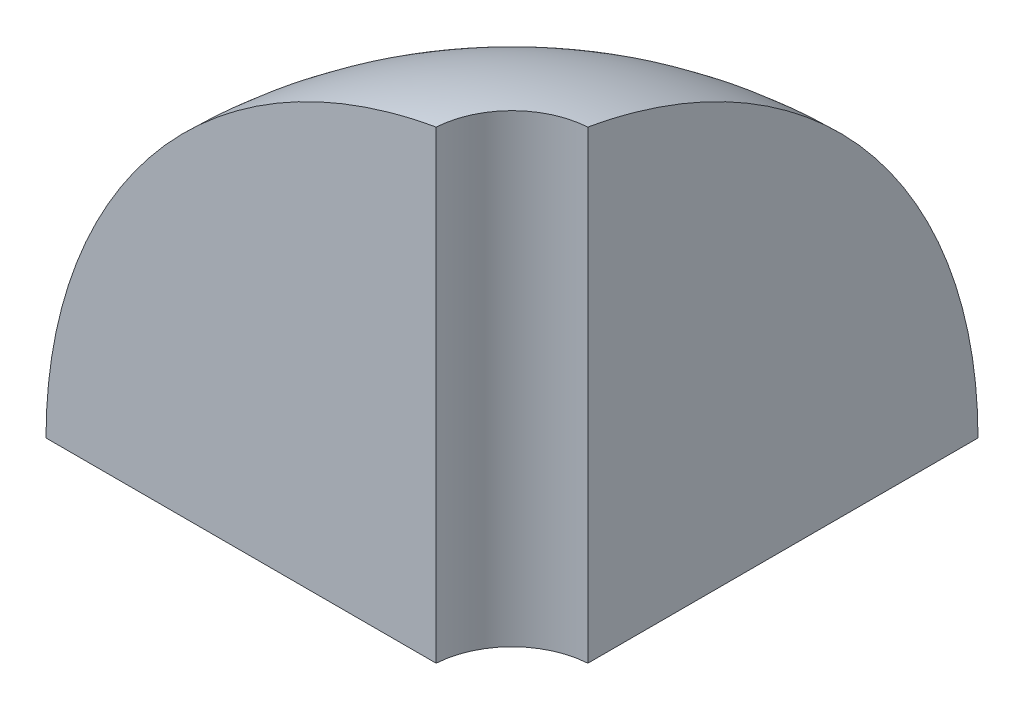
ISO-10303-21;
HEADER;
FILE_DESCRIPTION(('STEP AP214'),'2;1');
FILE_NAME('part.step','',(''),(''),'','','');
FILE_SCHEMA(('AUTOMOTIVE_DESIGN { 1 0 10303 214 1 1 1 1 }'));
ENDSEC;
DATA;
#1=APPLICATION_CONTEXT('core data for automotive mechanical design processes');
#2=APPLICATION_PROTOCOL_DEFINITION('international standard','automotive_design',2000,#1);
#3=PRODUCT_CONTEXT('',#1,'mechanical');
#4=PRODUCT('Part','Part','',(#3));
#5=PRODUCT_RELATED_PRODUCT_CATEGORY('part','',(#4));
#6=PRODUCT_DEFINITION_FORMATION('','',#4);
#7=PRODUCT_DEFINITION_CONTEXT('part definition',#1,'design');
#8=PRODUCT_DEFINITION('design','',#6,#7);
#9=PRODUCT_DEFINITION_SHAPE('','',#8);
#10=(LENGTH_UNIT() NAMED_UNIT(*) SI_UNIT(.MILLI.,.METRE.));
#11=(NAMED_UNIT(*) PLANE_ANGLE_UNIT() SI_UNIT($,.RADIAN.));
#12=(NAMED_UNIT(*) SI_UNIT($,.STERADIAN.) SOLID_ANGLE_UNIT());
#13=UNCERTAINTY_MEASURE_WITH_UNIT(LENGTH_MEASURE(1.E-05),#10,'distance_accuracy_value','');
#14=(GEOMETRIC_REPRESENTATION_CONTEXT(3) GLOBAL_UNCERTAINTY_ASSIGNED_CONTEXT((#13)) GLOBAL_UNIT_ASSIGNED_CONTEXT((#10,
#11,#12)) REPRESENTATION_CONTEXT('',''));
#15=CARTESIAN_POINT('',(0.,0.,0.));
#16=DIRECTION('',(0.,0.,1.));
#17=DIRECTION('',(1.,0.,0.));
#18=AXIS2_PLACEMENT_3D('',#15,#16,#17);
#19=CARTESIAN_POINT('',(0.,0.,0.));
#20=DIRECTION('',(0.,1.,0.));
#21=DIRECTION('',(1.,0.,0.));
#22=AXIS2_PLACEMENT_3D('',#19,#20,#21);
#23=SPHERICAL_SURFACE('',#22,44.);
#24=CARTESIAN_POINT('',(0.,43.3386663385019,0.));
#25=DIRECTION('',(0.,-1.,0.));
#26=DIRECTION('',(0.,0.,-1.));
#27=AXIS2_PLACEMENT_3D('',#24,#25,#26);
#28=CIRCLE('',#27,7.6);
#29=CARTESIAN_POINT('',(-0.499999999999999,43.3386663385019,-7.58353479585872));
#30=VERTEX_POINT('',#29);
#31=CARTESIAN_POINT('',(-7.58353479585872,43.3386663385019,-0.499999999999999));
#32=VERTEX_POINT('',#31);
#33=EDGE_CURVE('E86',#30,#32,#28,.F.);
#34=ORIENTED_EDGE('',*,*,#33,.F.);
#35=CARTESIAN_POINT('',(-0.499999999999998,0.,0.));
#36=DIRECTION('',(-1.,0.,0.));
#37=DIRECTION('',(0.,0.,1.));
#38=AXIS2_PLACEMENT_3D('',#35,#36,#37);
#39=CIRCLE('',#38,43.9971589991899);
#40=CARTESIAN_POINT('',(-0.500000000000003,0.,-43.9971589991899));
#41=VERTEX_POINT('',#40);
#42=EDGE_CURVE('E47',#41,#30,#39,.F.);
#43=ORIENTED_EDGE('',*,*,#42,.F.);
#44=CARTESIAN_POINT('',(0.,0.,0.));
#45=DIRECTION('',(0.,1.,0.));
#46=DIRECTION('',(0.,0.,1.));
#47=AXIS2_PLACEMENT_3D('',#44,#45,#46);
#48=CIRCLE('',#47,44.);
#49=CARTESIAN_POINT('',(-43.9971589991899,0.,-0.499999999999995));
#50=VERTEX_POINT('',#49);
#51=EDGE_CURVE('E62',#50,#41,#48,.F.);
#52=ORIENTED_EDGE('',*,*,#51,.F.);
#53=CARTESIAN_POINT('',(0.,0.,-0.5));
#54=DIRECTION('',(0.,0.,-1.));
#55=DIRECTION('',(-1.,0.,0.));
#56=AXIS2_PLACEMENT_3D('',#53,#54,#55);
#57=CIRCLE('',#56,43.9971589991899);
#58=EDGE_CURVE('E11',#32,#50,#57,.F.);
#59=ORIENTED_EDGE('',*,*,#58,.F.);
#60=EDGE_LOOP('',(#34,#43,#52,#59));
#61=FACE_BOUND('',#60,.T.);
#62=ADVANCED_FACE('F39',(#61),#23,.T.);
#63=CARTESIAN_POINT('',(-0.499999999999998,-44.,-0.5));
#64=DIRECTION('',(0.,0.,-1.));
#65=DIRECTION('',(-1.,0.,0.));
#66=AXIS2_PLACEMENT_3D('',#63,#64,#65);
#67=PLANE('',#66);
#68=DIRECTION('',(1.,0.,0.));
#69=VECTOR('',#68,1.);
#70=CARTESIAN_POINT('',(-0.499999999999998,0.,-0.5));
#71=LINE('',#70,#69);
#72=CARTESIAN_POINT('',(-7.58353479585872,0.,-0.499999999999999));
#73=VERTEX_POINT('',#72);
#74=EDGE_CURVE('E90',#50,#73,#71,.T.);
#75=ORIENTED_EDGE('',*,*,#74,.T.);
#76=DIRECTION('',(0.,-1.,0.));
#77=VECTOR('',#76,1.);
#78=CARTESIAN_POINT('',(-7.58353479585872,43.9943178149179,-0.499999999999999));
#79=LINE('',#78,#77);
#80=EDGE_CURVE('E54',#73,#32,#79,.F.);
#81=ORIENTED_EDGE('',*,*,#80,.T.);
#82=ORIENTED_EDGE('',*,*,#58,.T.);
#83=EDGE_LOOP('',(#75,#81,#82));
#84=FACE_BOUND('',#83,.T.);
#85=ADVANCED_FACE('F104',(#84),#67,.F.);
#86=CARTESIAN_POINT('',(-0.500000000000003,-44.,-43.9971589991899));
#87=DIRECTION('',(-1.,0.,0.));
#88=DIRECTION('',(0.,0.,1.));
#89=AXIS2_PLACEMENT_3D('',#86,#87,#88);
#90=PLANE('',#89);
#91=ORIENTED_EDGE('',*,*,#42,.T.);
#92=DIRECTION('',(0.,-1.,0.));
#93=VECTOR('',#92,1.);
#94=CARTESIAN_POINT('',(-0.499999999999999,43.9943178149179,-7.58353479585872));
#95=LINE('',#94,#93);
#96=CARTESIAN_POINT('',(-0.499999999999999,0.,-7.58353479585872));
#97=VERTEX_POINT('',#96);
#98=EDGE_CURVE('E75',#30,#97,#95,.T.);
#99=ORIENTED_EDGE('',*,*,#98,.T.);
#100=DIRECTION('',(0.,0.,1.));
#101=VECTOR('',#100,1.);
#102=CARTESIAN_POINT('',(-0.499999999999998,0.,0.));
#103=LINE('',#102,#101);
#104=EDGE_CURVE('E83',#41,#97,#103,.T.);
#105=ORIENTED_EDGE('',*,*,#104,.F.);
#106=EDGE_LOOP('',(#91,#99,#105));
#107=FACE_BOUND('',#106,.T.);
#108=ADVANCED_FACE('F82',(#107),#90,.F.);
#109=CARTESIAN_POINT('',(-43.9971589991899,0.,0.));
#110=DIRECTION('',(0.,1.,0.));
#111=DIRECTION('',(0.,0.,1.));
#112=AXIS2_PLACEMENT_3D('',#109,#110,#111);
#113=PLANE('',#112);
#114=ORIENTED_EDGE('',*,*,#104,.T.);
#115=CARTESIAN_POINT('',(0.,0.,0.));
#116=DIRECTION('',(0.,-1.,0.));
#117=DIRECTION('',(0.,0.,-1.));
#118=AXIS2_PLACEMENT_3D('',#115,#116,#117);
#119=CIRCLE('',#118,7.6);
#120=EDGE_CURVE('E72',#73,#97,#119,.T.);
#121=ORIENTED_EDGE('',*,*,#120,.F.);
#122=ORIENTED_EDGE('',*,*,#74,.F.);
#123=ORIENTED_EDGE('',*,*,#51,.T.);
#124=EDGE_LOOP('',(#114,#121,#122,#123));
#125=FACE_BOUND('',#124,.T.);
#126=ADVANCED_FACE('F88',(#125),#113,.F.);
#127=CARTESIAN_POINT('',(0.,43.9943178149179,0.));
#128=DIRECTION('',(0.,-1.,0.));
#129=DIRECTION('',(0.,0.,-1.));
#130=AXIS2_PLACEMENT_3D('',#127,#128,#129);
#131=CYLINDRICAL_SURFACE('',#130,7.6);
#132=ORIENTED_EDGE('',*,*,#120,.T.);
#133=ORIENTED_EDGE('',*,*,#98,.F.);
#134=ORIENTED_EDGE('',*,*,#33,.T.);
#135=ORIENTED_EDGE('',*,*,#80,.F.);
#136=EDGE_LOOP('',(#132,#133,#134,#135));
#137=FACE_BOUND('',#136,.T.);
#138=ADVANCED_FACE('F74',(#137),#131,.F.);
#139=CLOSED_SHELL('',(#62,#85,#108,#126,#138));
#140=MANIFOLD_SOLID_BREP('B2',#139);
#141=ADVANCED_BREP_SHAPE_REPRESENTATION('',(#18,#140),#14);
#142=SHAPE_DEFINITION_REPRESENTATION(#9,#141);
ENDSEC;
END-ISO-10303-21;
